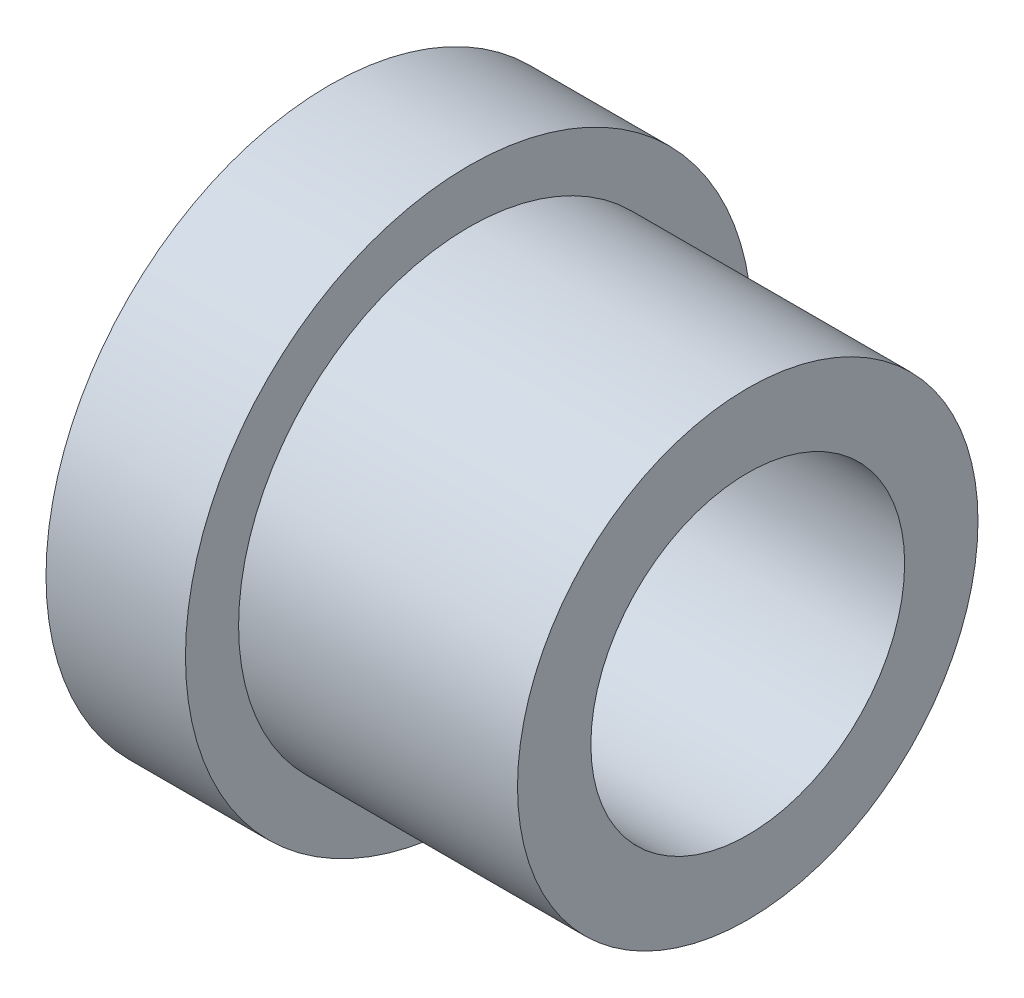
ISO-10303-21;
HEADER;
FILE_DESCRIPTION(('STEP AP214'),'2;1');
FILE_NAME('part.step','',(''),(''),'','','');
FILE_SCHEMA(('AUTOMOTIVE_DESIGN { 1 0 10303 214 1 1 1 1 }'));
ENDSEC;
DATA;
#1=APPLICATION_CONTEXT('core data for automotive mechanical design processes');
#2=APPLICATION_PROTOCOL_DEFINITION('international standard','automotive_design',2000,#1);
#3=PRODUCT_CONTEXT('',#1,'mechanical');
#4=PRODUCT('Part','Part','',(#3));
#5=PRODUCT_RELATED_PRODUCT_CATEGORY('part','',(#4));
#6=PRODUCT_DEFINITION_FORMATION('','',#4);
#7=PRODUCT_DEFINITION_CONTEXT('part definition',#1,'design');
#8=PRODUCT_DEFINITION('design','',#6,#7);
#9=PRODUCT_DEFINITION_SHAPE('','',#8);
#10=(LENGTH_UNIT() NAMED_UNIT(*) SI_UNIT(.MILLI.,.METRE.));
#11=(NAMED_UNIT(*) PLANE_ANGLE_UNIT() SI_UNIT($,.RADIAN.));
#12=(NAMED_UNIT(*) SI_UNIT($,.STERADIAN.) SOLID_ANGLE_UNIT());
#13=UNCERTAINTY_MEASURE_WITH_UNIT(LENGTH_MEASURE(1.E-05),#10,'distance_accuracy_value','');
#14=(GEOMETRIC_REPRESENTATION_CONTEXT(3) GLOBAL_UNCERTAINTY_ASSIGNED_CONTEXT((#13)) GLOBAL_UNIT_ASSIGNED_CONTEXT((#10,
#11,#12)) REPRESENTATION_CONTEXT('',''));
#15=CARTESIAN_POINT('',(0.,0.,0.));
#16=DIRECTION('',(0.,0.,1.));
#17=DIRECTION('',(1.,0.,0.));
#18=AXIS2_PLACEMENT_3D('',#15,#16,#17);
#19=CARTESIAN_POINT('',(0.,0.,0.));
#20=DIRECTION('',(-1.,0.,0.));
#21=DIRECTION('',(0.,0.,1.));
#22=AXIS2_PLACEMENT_3D('',#19,#20,#21);
#23=CYLINDRICAL_SURFACE('',#22,11.25);
#24=CARTESIAN_POINT('',(6.5,0.,0.));
#25=DIRECTION('',(-1.,0.,0.));
#26=DIRECTION('',(0.,0.,1.));
#27=AXIS2_PLACEMENT_3D('',#24,#25,#26);
#28=CIRCLE('',#27,11.25);
#29=CARTESIAN_POINT('',(6.5,0.,11.25));
#30=VERTEX_POINT('',#29);
#31=EDGE_CURVE('E71',#30,#30,#28,.T.);
#32=ORIENTED_EDGE('',*,*,#31,.F.);
#33=EDGE_LOOP('',(#32));
#34=FACE_BOUND('',#33,.T.);
#35=CARTESIAN_POINT('',(0.,0.,0.));
#36=DIRECTION('',(-1.,0.,0.));
#37=DIRECTION('',(0.,0.,1.));
#38=AXIS2_PLACEMENT_3D('',#35,#36,#37);
#39=CIRCLE('',#38,11.25);
#40=CARTESIAN_POINT('',(0.,0.,11.25));
#41=VERTEX_POINT('',#40);
#42=EDGE_CURVE('E10',#41,#41,#39,.T.);
#43=ORIENTED_EDGE('',*,*,#42,.T.);
#44=EDGE_LOOP('',(#43));
#45=FACE_BOUND('',#44,.T.);
#46=ADVANCED_FACE('F31',(#34,#45),#23,.F.);
#47=CARTESIAN_POINT('',(0.,0.,-11.25));
#48=DIRECTION('',(1.,0.,0.));
#49=DIRECTION('',(0.,0.,-1.));
#50=AXIS2_PLACEMENT_3D('',#47,#48,#49);
#51=PLANE('',#50);
#52=ORIENTED_EDGE('',*,*,#42,.F.);
#53=EDGE_LOOP('',(#52));
#54=FACE_BOUND('',#53,.T.);
#55=CARTESIAN_POINT('',(0.,0.,0.));
#56=DIRECTION('',(-1.,0.,0.));
#57=DIRECTION('',(0.,0.,1.));
#58=AXIS2_PLACEMENT_3D('',#55,#56,#57);
#59=CIRCLE('',#58,20.32);
#60=CARTESIAN_POINT('',(0.,0.,20.32));
#61=VERTEX_POINT('',#60);
#62=EDGE_CURVE('E37',#61,#61,#59,.T.);
#63=ORIENTED_EDGE('',*,*,#62,.T.);
#64=EDGE_LOOP('',(#63));
#65=FACE_BOUND('',#64,.T.);
#66=ADVANCED_FACE('F78',(#54,#65),#51,.F.);
#67=CARTESIAN_POINT('',(0.,0.,0.));
#68=DIRECTION('',(-1.,0.,0.));
#69=DIRECTION('',(0.,0.,1.));
#70=AXIS2_PLACEMENT_3D('',#67,#68,#69);
#71=CYLINDRICAL_SURFACE('',#70,20.32);
#72=ORIENTED_EDGE('',*,*,#62,.F.);
#73=EDGE_LOOP('',(#72));
#74=FACE_BOUND('',#73,.T.);
#75=CARTESIAN_POINT('',(10.,0.,0.));
#76=DIRECTION('',(-1.,0.,0.));
#77=DIRECTION('',(0.,0.,1.));
#78=AXIS2_PLACEMENT_3D('',#75,#76,#77);
#79=CIRCLE('',#78,20.32);
#80=CARTESIAN_POINT('',(10.,0.,20.32));
#81=VERTEX_POINT('',#80);
#82=EDGE_CURVE('E41',#81,#81,#79,.T.);
#83=ORIENTED_EDGE('',*,*,#82,.T.);
#84=EDGE_LOOP('',(#83));
#85=FACE_BOUND('',#84,.T.);
#86=ADVANCED_FACE('F82',(#74,#85),#71,.T.);
#87=CARTESIAN_POINT('',(10.,0.,-20.32));
#88=DIRECTION('',(-1.,0.,0.));
#89=DIRECTION('',(0.,0.,1.));
#90=AXIS2_PLACEMENT_3D('',#87,#88,#89);
#91=PLANE('',#90);
#92=ORIENTED_EDGE('',*,*,#82,.F.);
#93=EDGE_LOOP('',(#92));
#94=FACE_BOUND('',#93,.T.);
#95=CARTESIAN_POINT('',(10.,0.,0.));
#96=DIRECTION('',(-1.,0.,0.));
#97=DIRECTION('',(0.,0.,1.));
#98=AXIS2_PLACEMENT_3D('',#95,#96,#97);
#99=CIRCLE('',#98,16.51);
#100=CARTESIAN_POINT('',(10.,0.,16.51));
#101=VERTEX_POINT('',#100);
#102=EDGE_CURVE('E45',#101,#101,#99,.T.);
#103=ORIENTED_EDGE('',*,*,#102,.T.);
#104=EDGE_LOOP('',(#103));
#105=FACE_BOUND('',#104,.T.);
#106=ADVANCED_FACE('F87',(#94,#105),#91,.F.);
#107=CARTESIAN_POINT('',(0.,0.,0.));
#108=DIRECTION('',(-1.,0.,0.));
#109=DIRECTION('',(0.,0.,1.));
#110=AXIS2_PLACEMENT_3D('',#107,#108,#109);
#111=CYLINDRICAL_SURFACE('',#110,16.51);
#112=ORIENTED_EDGE('',*,*,#102,.F.);
#113=EDGE_LOOP('',(#112));
#114=FACE_BOUND('',#113,.T.);
#115=CARTESIAN_POINT('',(30.,0.,0.));
#116=DIRECTION('',(-1.,0.,0.));
#117=DIRECTION('',(0.,0.,1.));
#118=AXIS2_PLACEMENT_3D('',#115,#116,#117);
#119=CIRCLE('',#118,16.51);
#120=CARTESIAN_POINT('',(30.,0.,16.51));
#121=VERTEX_POINT('',#120);
#122=EDGE_CURVE('E50',#121,#121,#119,.T.);
#123=ORIENTED_EDGE('',*,*,#122,.T.);
#124=EDGE_LOOP('',(#123));
#125=FACE_BOUND('',#124,.T.);
#126=ADVANCED_FACE('F93',(#114,#125),#111,.T.);
#127=CARTESIAN_POINT('',(30.,0.,-16.51));
#128=DIRECTION('',(-1.,0.,0.));
#129=DIRECTION('',(0.,0.,1.));
#130=AXIS2_PLACEMENT_3D('',#127,#128,#129);
#131=PLANE('',#130);
#132=ORIENTED_EDGE('',*,*,#122,.F.);
#133=EDGE_LOOP('',(#132));
#134=FACE_BOUND('',#133,.T.);
#135=CARTESIAN_POINT('',(30.,0.,0.));
#136=DIRECTION('',(-1.,0.,0.));
#137=DIRECTION('',(0.,0.,1.));
#138=AXIS2_PLACEMENT_3D('',#135,#136,#137);
#139=CIRCLE('',#138,11.25);
#140=CARTESIAN_POINT('',(30.,0.,11.25));
#141=VERTEX_POINT('',#140);
#142=EDGE_CURVE('E53',#141,#141,#139,.T.);
#143=ORIENTED_EDGE('',*,*,#142,.T.);
#144=EDGE_LOOP('',(#143));
#145=FACE_BOUND('',#144,.T.);
#146=ADVANCED_FACE('F97',(#134,#145),#131,.F.);
#147=CARTESIAN_POINT('',(0.,0.,0.));
#148=DIRECTION('',(-1.,0.,0.));
#149=DIRECTION('',(0.,0.,1.));
#150=AXIS2_PLACEMENT_3D('',#147,#148,#149);
#151=CYLINDRICAL_SURFACE('',#150,11.25);
#152=ORIENTED_EDGE('',*,*,#142,.F.);
#153=EDGE_LOOP('',(#152));
#154=FACE_BOUND('',#153,.T.);
#155=CARTESIAN_POINT('',(12.5,0.,0.));
#156=DIRECTION('',(-1.,0.,0.));
#157=DIRECTION('',(0.,0.,1.));
#158=AXIS2_PLACEMENT_3D('',#155,#156,#157);
#159=CIRCLE('',#158,11.25);
#160=CARTESIAN_POINT('',(12.5,0.,11.25));
#161=VERTEX_POINT('',#160);
#162=EDGE_CURVE('E56',#161,#161,#159,.T.);
#163=ORIENTED_EDGE('',*,*,#162,.T.);
#164=EDGE_LOOP('',(#163));
#165=FACE_BOUND('',#164,.T.);
#166=ADVANCED_FACE('F101',(#154,#165),#151,.F.);
#167=CARTESIAN_POINT('',(12.5,0.,-11.25));
#168=DIRECTION('',(-1.,0.,0.));
#169=DIRECTION('',(0.,0.,1.));
#170=AXIS2_PLACEMENT_3D('',#167,#168,#169);
#171=PLANE('',#170);
#172=ORIENTED_EDGE('',*,*,#162,.F.);
#173=EDGE_LOOP('',(#172));
#174=FACE_BOUND('',#173,.T.);
#175=CARTESIAN_POINT('',(12.5,0.,0.));
#176=DIRECTION('',(-1.,0.,0.));
#177=DIRECTION('',(0.,0.,1.));
#178=AXIS2_PLACEMENT_3D('',#175,#176,#177);
#179=CIRCLE('',#178,4.5);
#180=CARTESIAN_POINT('',(12.5,0.,4.5));
#181=VERTEX_POINT('',#180);
#182=EDGE_CURVE('E59',#181,#181,#179,.T.);
#183=ORIENTED_EDGE('',*,*,#182,.T.);
#184=EDGE_LOOP('',(#183));
#185=FACE_BOUND('',#184,.T.);
#186=ADVANCED_FACE('F105',(#174,#185),#171,.F.);
#187=CARTESIAN_POINT('',(0.,0.,0.));
#188=DIRECTION('',(-1.,0.,0.));
#189=DIRECTION('',(0.,0.,1.));
#190=AXIS2_PLACEMENT_3D('',#187,#188,#189);
#191=CYLINDRICAL_SURFACE('',#190,4.5);
#192=ORIENTED_EDGE('',*,*,#182,.F.);
#193=EDGE_LOOP('',(#192));
#194=FACE_BOUND('',#193,.T.);
#195=CARTESIAN_POINT('',(9.5,0.,0.));
#196=DIRECTION('',(-1.,0.,0.));
#197=DIRECTION('',(0.,0.,1.));
#198=AXIS2_PLACEMENT_3D('',#195,#196,#197);
#199=CIRCLE('',#198,4.5);
#200=CARTESIAN_POINT('',(9.5,0.,4.5));
#201=VERTEX_POINT('',#200);
#202=EDGE_CURVE('E62',#201,#201,#199,.T.);
#203=ORIENTED_EDGE('',*,*,#202,.T.);
#204=EDGE_LOOP('',(#203));
#205=FACE_BOUND('',#204,.T.);
#206=ADVANCED_FACE('F109',(#194,#205),#191,.F.);
#207=CARTESIAN_POINT('',(9.5,0.,-8.5));
#208=DIRECTION('',(1.,0.,0.));
#209=DIRECTION('',(0.,0.,-1.));
#210=AXIS2_PLACEMENT_3D('',#207,#208,#209);
#211=PLANE('',#210);
#212=ORIENTED_EDGE('',*,*,#202,.F.);
#213=EDGE_LOOP('',(#212));
#214=FACE_BOUND('',#213,.T.);
#215=CARTESIAN_POINT('',(9.5,0.,0.));
#216=DIRECTION('',(-1.,0.,0.));
#217=DIRECTION('',(0.,0.,1.));
#218=AXIS2_PLACEMENT_3D('',#215,#216,#217);
#219=CIRCLE('',#218,8.5);
#220=CARTESIAN_POINT('',(9.5,0.,8.5));
#221=VERTEX_POINT('',#220);
#222=EDGE_CURVE('E65',#221,#221,#219,.T.);
#223=ORIENTED_EDGE('',*,*,#222,.T.);
#224=EDGE_LOOP('',(#223));
#225=FACE_BOUND('',#224,.T.);
#226=ADVANCED_FACE('F113',(#214,#225),#211,.F.);
#227=CARTESIAN_POINT('',(0.,0.,0.));
#228=DIRECTION('',(-1.,0.,0.));
#229=DIRECTION('',(0.,0.,1.));
#230=AXIS2_PLACEMENT_3D('',#227,#228,#229);
#231=CYLINDRICAL_SURFACE('',#230,8.5);
#232=ORIENTED_EDGE('',*,*,#222,.F.);
#233=EDGE_LOOP('',(#232));
#234=FACE_BOUND('',#233,.T.);
#235=CARTESIAN_POINT('',(6.5,0.,0.));
#236=DIRECTION('',(-1.,0.,0.));
#237=DIRECTION('',(0.,0.,1.));
#238=AXIS2_PLACEMENT_3D('',#235,#236,#237);
#239=CIRCLE('',#238,8.5);
#240=CARTESIAN_POINT('',(6.5,0.,8.5));
#241=VERTEX_POINT('',#240);
#242=EDGE_CURVE('E68',#241,#241,#239,.T.);
#243=ORIENTED_EDGE('',*,*,#242,.T.);
#244=EDGE_LOOP('',(#243));
#245=FACE_BOUND('',#244,.T.);
#246=ADVANCED_FACE('F117',(#234,#245),#231,.F.);
#247=CARTESIAN_POINT('',(6.5,0.,-8.5));
#248=DIRECTION('',(1.,0.,0.));
#249=DIRECTION('',(0.,0.,-1.));
#250=AXIS2_PLACEMENT_3D('',#247,#248,#249);
#251=PLANE('',#250);
#252=ORIENTED_EDGE('',*,*,#242,.F.);
#253=EDGE_LOOP('',(#252));
#254=FACE_BOUND('',#253,.T.);
#255=ORIENTED_EDGE('',*,*,#31,.T.);
#256=EDGE_LOOP('',(#255));
#257=FACE_BOUND('',#256,.T.);
#258=ADVANCED_FACE('F75',(#254,#257),#251,.F.);
#259=CLOSED_SHELL('',(#46,#66,#86,#106,#126,#146,#166,#186,#206,#226,#246,#258));
#260=MANIFOLD_SOLID_BREP('B2',#259);
#261=ADVANCED_BREP_SHAPE_REPRESENTATION('',(#18,#260),#14);
#262=SHAPE_DEFINITION_REPRESENTATION(#9,#261);
ENDSEC;
END-ISO-10303-21;
